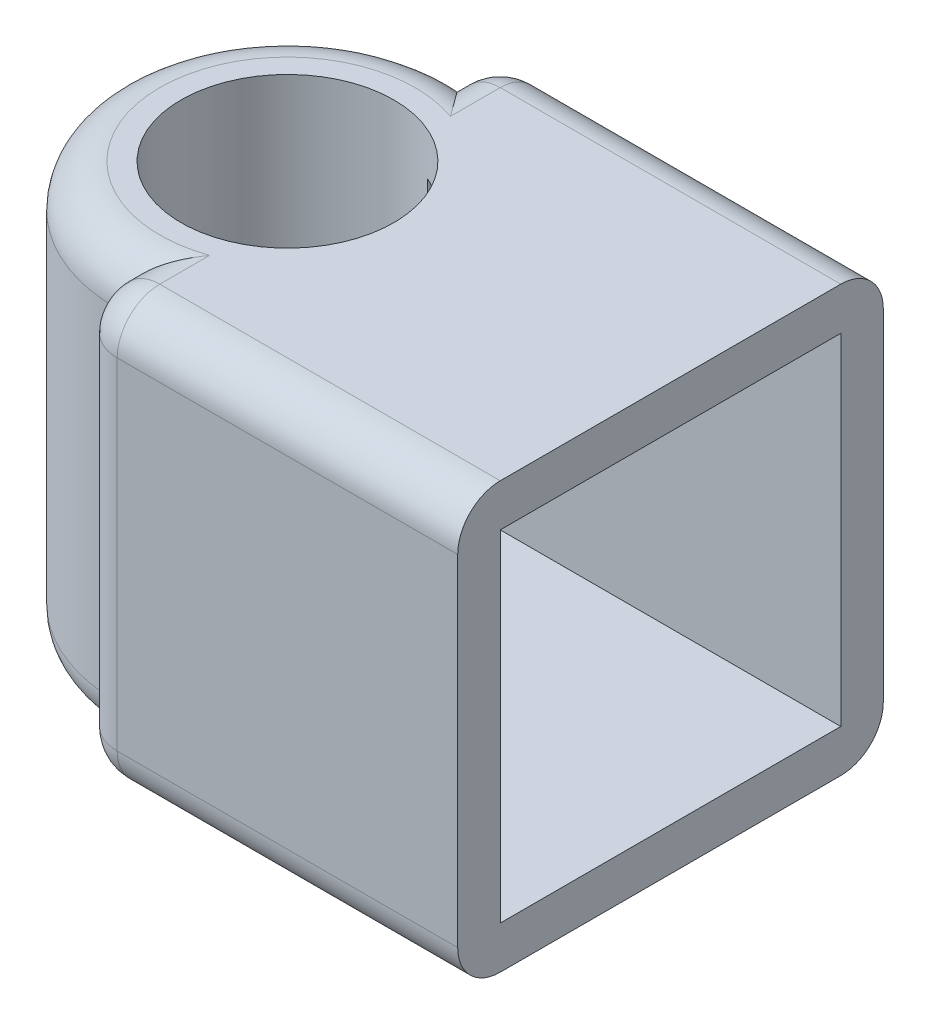
ISO-10303-21;
HEADER;
FILE_DESCRIPTION(('STEP AP214'),'2;1');
FILE_NAME('part.step','',(''),(''),'','','');
FILE_SCHEMA(('AUTOMOTIVE_DESIGN { 1 0 10303 214 1 1 1 1 }'));
ENDSEC;
DATA;
#1=APPLICATION_CONTEXT('core data for automotive mechanical design processes');
#2=APPLICATION_PROTOCOL_DEFINITION('international standard','automotive_design',2000,#1);
#3=PRODUCT_CONTEXT('',#1,'mechanical');
#4=PRODUCT('Part','Part','',(#3));
#5=PRODUCT_RELATED_PRODUCT_CATEGORY('part','',(#4));
#6=PRODUCT_DEFINITION_FORMATION('','',#4);
#7=PRODUCT_DEFINITION_CONTEXT('part definition',#1,'design');
#8=PRODUCT_DEFINITION('design','',#6,#7);
#9=PRODUCT_DEFINITION_SHAPE('','',#8);
#10=(LENGTH_UNIT() NAMED_UNIT(*) SI_UNIT(.MILLI.,.METRE.));
#11=(NAMED_UNIT(*) PLANE_ANGLE_UNIT() SI_UNIT($,.RADIAN.));
#12=(NAMED_UNIT(*) SI_UNIT($,.STERADIAN.) SOLID_ANGLE_UNIT());
#13=UNCERTAINTY_MEASURE_WITH_UNIT(LENGTH_MEASURE(1.E-05),#10,'distance_accuracy_value','');
#14=(GEOMETRIC_REPRESENTATION_CONTEXT(3) GLOBAL_UNCERTAINTY_ASSIGNED_CONTEXT((#13)) GLOBAL_UNIT_ASSIGNED_CONTEXT((#10,
#11,#12)) REPRESENTATION_CONTEXT('',''));
#15=CARTESIAN_POINT('',(0.,0.,0.));
#16=DIRECTION('',(0.,0.,1.));
#17=DIRECTION('',(1.,0.,0.));
#18=AXIS2_PLACEMENT_3D('',#15,#16,#17);
#19=CARTESIAN_POINT('',(10.,0.,1.11022302462516E-13));
#20=DIRECTION('',(-1.,0.,0.));
#21=DIRECTION('',(0.,0.,1.));
#22=AXIS2_PLACEMENT_3D('',#19,#20,#21);
#23=PLANE('',#22);
#24=DIRECTION('',(0.,0.,-1.));
#25=VECTOR('',#24,1.);
#26=CARTESIAN_POINT('',(10.,90.0000000000001,-10.));
#27=LINE('',#26,#25);
#28=CARTESIAN_POINT('',(10.,90.0000000000001,-72.9128784747792));
#29=VERTEX_POINT('',#28);
#30=CARTESIAN_POINT('',(10.,90.0000000000001,-90.));
#31=VERTEX_POINT('',#30);
#32=EDGE_CURVE('E208',#29,#31,#27,.T.);
#33=ORIENTED_EDGE('',*,*,#32,.F.);
#34=DIRECTION('',(0.,-1.,0.));
#35=VECTOR('',#34,1.);
#36=CARTESIAN_POINT('',(10.,100.,-72.9128784747792));
#37=LINE('',#36,#35);
#38=CARTESIAN_POINT('',(10.,10.0000000000001,-72.9128784747793));
#39=VERTEX_POINT('',#38);
#40=EDGE_CURVE('E184',#29,#39,#37,.T.);
#41=ORIENTED_EDGE('',*,*,#40,.T.);
#42=DIRECTION('',(0.,0.,-1.));
#43=VECTOR('',#42,1.);
#44=CARTESIAN_POINT('',(9.99999999999999,10.0000000000001,-10.));
#45=LINE('',#44,#43);
#46=CARTESIAN_POINT('',(10.,10.,-90.));
#47=VERTEX_POINT('',#46);
#48=EDGE_CURVE('E534',#39,#47,#45,.T.);
#49=ORIENTED_EDGE('',*,*,#48,.T.);
#50=DIRECTION('',(0.,-1.,0.));
#51=VECTOR('',#50,1.);
#52=CARTESIAN_POINT('',(10.,90.0000000000001,-90.));
#53=LINE('',#52,#51);
#54=EDGE_CURVE('E207',#31,#47,#53,.T.);
#55=ORIENTED_EDGE('',*,*,#54,.F.);
#56=EDGE_LOOP('',(#33,#41,#49,#55));
#57=FACE_BOUND('',#56,.T.);
#58=ADVANCED_FACE('F52',(#57),#23,.F.);
#59=CARTESIAN_POINT('',(90.,0.,-100.));
#60=DIRECTION('',(0.,1.,0.));
#61=DIRECTION('',(0.,0.,1.));
#62=AXIS2_PLACEMENT_3D('',#59,#60,#61);
#63=PLANE('',#62);
#64=CARTESIAN_POINT('',(0.,1.11022302462516E-13,-50.));
#65=DIRECTION('',(0.,-1.,0.));
#66=DIRECTION('',(0.,0.,-1.));
#67=AXIS2_PLACEMENT_3D('',#64,#65,#66);
#68=CIRCLE('',#67,25.);
#69=CARTESIAN_POINT('',(0.,1.12757025938492E-13,-75.0000000000001));
#70=VERTEX_POINT('',#69);
#71=EDGE_CURVE('E745',#70,#70,#68,.T.);
#72=ORIENTED_EDGE('',*,*,#71,.F.);
#73=EDGE_LOOP('',(#72));
#74=FACE_BOUND('',#73,.T.);
#75=CARTESIAN_POINT('',(0.,1.11022302462516E-13,-50.));
#76=DIRECTION('',(0.,1.,0.));
#77=DIRECTION('',(0.,0.,1.));
#78=AXIS2_PLACEMENT_3D('',#75,#76,#77);
#79=CIRCLE('',#78,30.);
#80=CARTESIAN_POINT('',(10.,0.,-21.7157287525382));
#81=VERTEX_POINT('',#80);
#82=CARTESIAN_POINT('',(10.,0.,-78.2842712474618));
#83=VERTEX_POINT('',#82);
#84=EDGE_CURVE('E189',#81,#83,#79,.F.);
#85=ORIENTED_EDGE('',*,*,#84,.T.);
#86=DIRECTION('',(0.,0.,1.));
#87=VECTOR('',#86,1.);
#88=CARTESIAN_POINT('',(10.,1.11022302462516E-13,-100.));
#89=LINE('',#88,#87);
#90=CARTESIAN_POINT('',(10.,0.,-90.0000000000001));
#91=VERTEX_POINT('',#90);
#92=EDGE_CURVE('E294',#83,#91,#89,.F.);
#93=ORIENTED_EDGE('',*,*,#92,.T.);
#94=DIRECTION('',(-1.,0.,0.));
#95=VECTOR('',#94,1.);
#96=CARTESIAN_POINT('',(90.,0.,-90.));
#97=LINE('',#96,#95);
#98=CARTESIAN_POINT('',(90.,0.,-90.));
#99=VERTEX_POINT('',#98);
#100=EDGE_CURVE('E280',#91,#99,#97,.F.);
#101=ORIENTED_EDGE('',*,*,#100,.T.);
#102=DIRECTION('',(0.,0.,-1.));
#103=VECTOR('',#102,1.);
#104=CARTESIAN_POINT('',(90.,0.,-100.));
#105=LINE('',#104,#103);
#106=CARTESIAN_POINT('',(90.,1.11022302462516E-13,-10.));
#107=VERTEX_POINT('',#106);
#108=EDGE_CURVE('E234',#107,#99,#105,.T.);
#109=ORIENTED_EDGE('',*,*,#108,.F.);
#110=DIRECTION('',(-1.,0.,0.));
#111=VECTOR('',#110,1.);
#112=CARTESIAN_POINT('',(90.,1.11022302462516E-13,-10.));
#113=LINE('',#112,#111);
#114=CARTESIAN_POINT('',(10.,1.11022302462516E-13,-10.));
#115=VERTEX_POINT('',#114);
#116=EDGE_CURVE('E276',#107,#115,#113,.T.);
#117=ORIENTED_EDGE('',*,*,#116,.T.);
#118=DIRECTION('',(0.,0.,1.));
#119=VECTOR('',#118,1.);
#120=CARTESIAN_POINT('',(10.,1.11022302462516E-13,-10.));
#121=LINE('',#120,#119);
#122=EDGE_CURVE('E291',#115,#81,#121,.F.);
#123=ORIENTED_EDGE('',*,*,#122,.T.);
#124=EDGE_LOOP('',(#85,#93,#101,#109,#117,#123));
#125=FACE_BOUND('',#124,.T.);
#126=ADVANCED_FACE('F415',(#74,#125),#63,.F.);
#127=CARTESIAN_POINT('',(90.,100.,-100.));
#128=DIRECTION('',(0.,0.,1.));
#129=DIRECTION('',(1.,0.,0.));
#130=AXIS2_PLACEMENT_3D('',#127,#128,#129);
#131=PLANE('',#130);
#132=DIRECTION('',(-1.,0.,0.));
#133=VECTOR('',#132,1.);
#134=CARTESIAN_POINT('',(90.,10.,-100.));
#135=LINE('',#134,#133);
#136=CARTESIAN_POINT('',(90.,10.,-100.));
#137=VERTEX_POINT('',#136);
#138=CARTESIAN_POINT('',(10.,10.0000000000001,-100.));
#139=VERTEX_POINT('',#138);
#140=EDGE_CURVE('E257',#137,#139,#135,.T.);
#141=ORIENTED_EDGE('',*,*,#140,.T.);
#142=DIRECTION('',(0.,1.,0.));
#143=VECTOR('',#142,1.);
#144=CARTESIAN_POINT('',(10.,90.,-100.));
#145=LINE('',#144,#143);
#146=CARTESIAN_POINT('',(10.,90.,-100.));
#147=VERTEX_POINT('',#146);
#148=EDGE_CURVE('E62',#139,#147,#145,.T.);
#149=ORIENTED_EDGE('',*,*,#148,.T.);
#150=DIRECTION('',(-1.,0.,0.));
#151=VECTOR('',#150,1.);
#152=CARTESIAN_POINT('',(90.,90.,-100.));
#153=LINE('',#152,#151);
#154=CARTESIAN_POINT('',(90.,90.,-100.));
#155=VERTEX_POINT('',#154);
#156=EDGE_CURVE('E261',#147,#155,#153,.F.);
#157=ORIENTED_EDGE('',*,*,#156,.T.);
#158=DIRECTION('',(0.,1.,0.));
#159=VECTOR('',#158,1.);
#160=CARTESIAN_POINT('',(90.,100.,-100.));
#161=LINE('',#160,#159);
#162=EDGE_CURVE('E238',#137,#155,#161,.T.);
#163=ORIENTED_EDGE('',*,*,#162,.F.);
#164=EDGE_LOOP('',(#141,#149,#157,#163));
#165=FACE_BOUND('',#164,.T.);
#166=ADVANCED_FACE('F421',(#165),#131,.F.);
#167=CARTESIAN_POINT('',(90.,100.,0.));
#168=DIRECTION('',(0.,-1.,0.));
#169=DIRECTION('',(0.,0.,-1.));
#170=AXIS2_PLACEMENT_3D('',#167,#168,#169);
#171=PLANE('',#170);
#172=DIRECTION('',(-1.,0.,0.));
#173=VECTOR('',#172,1.);
#174=CARTESIAN_POINT('',(90.,100.,-90.));
#175=LINE('',#174,#173);
#176=CARTESIAN_POINT('',(90.,100.,-90.));
#177=VERTEX_POINT('',#176);
#178=CARTESIAN_POINT('',(9.99999999999999,100.,-90.));
#179=VERTEX_POINT('',#178);
#180=EDGE_CURVE('E253',#177,#179,#175,.T.);
#181=ORIENTED_EDGE('',*,*,#180,.T.);
#182=DIRECTION('',(0.,0.,-1.));
#183=VECTOR('',#182,1.);
#184=CARTESIAN_POINT('',(10.,100.,-90.));
#185=LINE('',#184,#183);
#186=CARTESIAN_POINT('',(10.,100.,-78.284271247462));
#187=VERTEX_POINT('',#186);
#188=EDGE_CURVE('E310',#179,#187,#185,.F.);
#189=ORIENTED_EDGE('',*,*,#188,.T.);
#190=CARTESIAN_POINT('',(0.,100.,-50.));
#191=DIRECTION('',(0.,-1.,0.));
#192=DIRECTION('',(0.,0.,-1.));
#193=AXIS2_PLACEMENT_3D('',#190,#191,#192);
#194=CIRCLE('',#193,30.);
#195=CARTESIAN_POINT('',(10.,100.,-21.7157287525381));
#196=VERTEX_POINT('',#195);
#197=EDGE_CURVE('E304',#187,#196,#194,.F.);
#198=ORIENTED_EDGE('',*,*,#197,.T.);
#199=DIRECTION('',(0.,0.,-1.));
#200=VECTOR('',#199,1.);
#201=CARTESIAN_POINT('',(10.,100.,0.));
#202=LINE('',#201,#200);
#203=CARTESIAN_POINT('',(10.,100.,-10.0000000000001));
#204=VERTEX_POINT('',#203);
#205=EDGE_CURVE('E307',#196,#204,#202,.F.);
#206=ORIENTED_EDGE('',*,*,#205,.T.);
#207=DIRECTION('',(-1.,0.,0.));
#208=VECTOR('',#207,1.);
#209=CARTESIAN_POINT('',(90.,100.,-10.));
#210=LINE('',#209,#208);
#211=CARTESIAN_POINT('',(90.,100.,-10.));
#212=VERTEX_POINT('',#211);
#213=EDGE_CURVE('E250',#204,#212,#210,.F.);
#214=ORIENTED_EDGE('',*,*,#213,.T.);
#215=DIRECTION('',(0.,0.,1.));
#216=VECTOR('',#215,1.);
#217=CARTESIAN_POINT('',(90.,100.,0.));
#218=LINE('',#217,#216);
#219=EDGE_CURVE('E242',#177,#212,#218,.T.);
#220=ORIENTED_EDGE('',*,*,#219,.F.);
#221=EDGE_LOOP('',(#181,#189,#198,#206,#214,#220));
#222=FACE_BOUND('',#221,.T.);
#223=CARTESIAN_POINT('',(0.,100.,-50.));
#224=DIRECTION('',(0.,-1.,0.));
#225=DIRECTION('',(0.,0.,-1.));
#226=AXIS2_PLACEMENT_3D('',#223,#224,#225);
#227=CIRCLE('',#226,25.);
#228=CARTESIAN_POINT('',(0.,100.,-75.0000000000001));
#229=VERTEX_POINT('',#228);
#230=EDGE_CURVE('E200',#229,#229,#227,.T.);
#231=ORIENTED_EDGE('',*,*,#230,.T.);
#232=EDGE_LOOP('',(#231));
#233=FACE_BOUND('',#232,.T.);
#234=ADVANCED_FACE('F440',(#222,#233),#171,.F.);
#235=CARTESIAN_POINT('',(90.,0.,1.11022302462516E-13));
#236=DIRECTION('',(0.,0.,-1.));
#237=DIRECTION('',(0.,1.,0.));
#238=AXIS2_PLACEMENT_3D('',#235,#236,#237);
#239=PLANE('',#238);
#240=DIRECTION('',(-1.,0.,0.));
#241=VECTOR('',#240,1.);
#242=CARTESIAN_POINT('',(90.,90.0000000000001,0.));
#243=LINE('',#242,#241);
#244=CARTESIAN_POINT('',(90.,90.0000000000001,0.));
#245=VERTEX_POINT('',#244);
#246=CARTESIAN_POINT('',(9.99999999999999,90.0000000000001,0.));
#247=VERTEX_POINT('',#246);
#248=EDGE_CURVE('E283',#245,#247,#243,.T.);
#249=ORIENTED_EDGE('',*,*,#248,.T.);
#250=DIRECTION('',(0.,-1.,0.));
#251=VECTOR('',#250,1.);
#252=CARTESIAN_POINT('',(9.99999999999999,10.,0.));
#253=LINE('',#252,#251);
#254=CARTESIAN_POINT('',(9.99999999999999,10.,0.));
#255=VERTEX_POINT('',#254);
#256=EDGE_CURVE('E14',#247,#255,#253,.T.);
#257=ORIENTED_EDGE('',*,*,#256,.T.);
#258=DIRECTION('',(-1.,0.,0.));
#259=VECTOR('',#258,1.);
#260=CARTESIAN_POINT('',(90.,10.,-1.11022302462516E-13));
#261=LINE('',#260,#259);
#262=CARTESIAN_POINT('',(90.,10.,-1.11022302462516E-13));
#263=VERTEX_POINT('',#262);
#264=EDGE_CURVE('E190',#255,#263,#261,.F.);
#265=ORIENTED_EDGE('',*,*,#264,.T.);
#266=DIRECTION('',(0.,-1.,0.));
#267=VECTOR('',#266,1.);
#268=CARTESIAN_POINT('',(90.,0.,1.11022302462516E-13));
#269=LINE('',#268,#267);
#270=EDGE_CURVE('E246',#245,#263,#269,.T.);
#271=ORIENTED_EDGE('',*,*,#270,.F.);
#272=EDGE_LOOP('',(#249,#257,#265,#271));
#273=FACE_BOUND('',#272,.T.);
#274=ADVANCED_FACE('F435',(#273),#239,.F.);
#275=CARTESIAN_POINT('',(90.,0.,1.11022302462516E-13));
#276=DIRECTION('',(-1.,0.,0.));
#277=DIRECTION('',(0.,0.,1.));
#278=AXIS2_PLACEMENT_3D('',#275,#276,#277);
#279=PLANE('',#278);
#280=DIRECTION('',(0.,-1.,0.));
#281=VECTOR('',#280,1.);
#282=CARTESIAN_POINT('',(90.,90.0000000000001,-90.));
#283=LINE('',#282,#281);
#284=CARTESIAN_POINT('',(90.,90.0000000000001,-90.));
#285=VERTEX_POINT('',#284);
#286=CARTESIAN_POINT('',(90.,10.,-90.0000000000001));
#287=VERTEX_POINT('',#286);
#288=EDGE_CURVE('E224',#285,#287,#283,.T.);
#289=ORIENTED_EDGE('',*,*,#288,.T.);
#290=DIRECTION('',(0.,0.,-1.));
#291=VECTOR('',#290,1.);
#292=CARTESIAN_POINT('',(90.,10.,-10.));
#293=LINE('',#292,#291);
#294=CARTESIAN_POINT('',(90.,10.,-10.));
#295=VERTEX_POINT('',#294);
#296=EDGE_CURVE('E530',#295,#287,#293,.T.);
#297=ORIENTED_EDGE('',*,*,#296,.F.);
#298=DIRECTION('',(0.,-1.,0.));
#299=VECTOR('',#298,1.);
#300=CARTESIAN_POINT('',(90.,90.,-10.));
#301=LINE('',#300,#299);
#302=CARTESIAN_POINT('',(90.,90.,-10.));
#303=VERTEX_POINT('',#302);
#304=EDGE_CURVE('E214',#303,#295,#301,.T.);
#305=ORIENTED_EDGE('',*,*,#304,.F.);
#306=DIRECTION('',(0.,0.,-1.));
#307=VECTOR('',#306,1.);
#308=CARTESIAN_POINT('',(90.,90.,-10.));
#309=LINE('',#308,#307);
#310=EDGE_CURVE('E223',#303,#285,#309,.T.);
#311=ORIENTED_EDGE('',*,*,#310,.T.);
#312=EDGE_LOOP('',(#289,#297,#305,#311));
#313=FACE_BOUND('',#312,.T.);
#314=ORIENTED_EDGE('',*,*,#162,.T.);
#315=CARTESIAN_POINT('',(90.,90.0000000000001,-90.));
#316=DIRECTION('',(-1.,0.,0.));
#317=DIRECTION('',(0.,0.,1.));
#318=AXIS2_PLACEMENT_3D('',#315,#316,#317);
#319=CIRCLE('',#318,10.);
#320=EDGE_CURVE('E273',#155,#177,#319,.F.);
#321=ORIENTED_EDGE('',*,*,#320,.T.);
#322=ORIENTED_EDGE('',*,*,#219,.T.);
#323=CARTESIAN_POINT('',(90.,90.,-10.));
#324=DIRECTION('',(-1.,0.,0.));
#325=DIRECTION('',(0.,0.,1.));
#326=AXIS2_PLACEMENT_3D('',#323,#324,#325);
#327=CIRCLE('',#326,10.);
#328=EDGE_CURVE('E264',#212,#245,#327,.F.);
#329=ORIENTED_EDGE('',*,*,#328,.T.);
#330=ORIENTED_EDGE('',*,*,#270,.T.);
#331=CARTESIAN_POINT('',(90.,10.,-10.));
#332=DIRECTION('',(-1.,0.,0.));
#333=DIRECTION('',(0.,0.,1.));
#334=AXIS2_PLACEMENT_3D('',#331,#332,#333);
#335=CIRCLE('',#334,10.);
#336=EDGE_CURVE('E267',#263,#107,#335,.F.);
#337=ORIENTED_EDGE('',*,*,#336,.T.);
#338=ORIENTED_EDGE('',*,*,#108,.T.);
#339=CARTESIAN_POINT('',(90.,10.,-90.0000000000001));
#340=DIRECTION('',(-1.,0.,0.));
#341=DIRECTION('',(0.,0.,1.));
#342=AXIS2_PLACEMENT_3D('',#339,#340,#341);
#343=CIRCLE('',#342,10.);
#344=EDGE_CURVE('E270',#99,#137,#343,.F.);
#345=ORIENTED_EDGE('',*,*,#344,.T.);
#346=EDGE_LOOP('',(#314,#321,#322,#329,#330,#337,#338,#345));
#347=FACE_BOUND('',#346,.T.);
#348=ADVANCED_FACE('F428',(#313,#347),#279,.F.);
#349=CARTESIAN_POINT('',(9.99999999999999,10.0000000000001,-10.));
#350=VERTEX_POINT('',#349);
#351=CARTESIAN_POINT('',(10.,10.,-27.0871215252207));
#352=VERTEX_POINT('',#351);
#353=EDGE_CURVE('E198',#350,#352,#45,.T.);
#354=ORIENTED_EDGE('',*,*,#353,.T.);
#355=DIRECTION('',(0.,-1.,0.));
#356=VECTOR('',#355,1.);
#357=CARTESIAN_POINT('',(10.,100.,-27.0871215252209));
#358=LINE('',#357,#356);
#359=CARTESIAN_POINT('',(10.,90.0000000000001,-27.0871215252207));
#360=VERTEX_POINT('',#359);
#361=EDGE_CURVE('E181',#352,#360,#358,.F.);
#362=ORIENTED_EDGE('',*,*,#361,.T.);
#363=CARTESIAN_POINT('',(10.,90.0000000000001,-10.));
#364=VERTEX_POINT('',#363);
#365=EDGE_CURVE('E197',#364,#360,#27,.T.);
#366=ORIENTED_EDGE('',*,*,#365,.F.);
#367=DIRECTION('',(0.,-1.,0.));
#368=VECTOR('',#367,1.);
#369=CARTESIAN_POINT('',(10.,90.0000000000001,-10.));
#370=LINE('',#369,#368);
#371=EDGE_CURVE('E218',#364,#350,#370,.T.);
#372=ORIENTED_EDGE('',*,*,#371,.T.);
#373=EDGE_LOOP('',(#354,#362,#366,#372));
#374=FACE_BOUND('',#373,.T.);
#375=ADVANCED_FACE('F195',(#374),#23,.F.);
#376=CARTESIAN_POINT('',(-113.137084989848,10.0000000000001,-10.));
#377=DIRECTION('',(0.,-1.,0.));
#378=DIRECTION('',(0.,0.,-1.));
#379=AXIS2_PLACEMENT_3D('',#376,#377,#378);
#380=PLANE('',#379);
#381=ORIENTED_EDGE('',*,*,#48,.F.);
#382=CARTESIAN_POINT('',(0.,10.,-50.));
#383=DIRECTION('',(0.,-1.,0.));
#384=DIRECTION('',(0.,0.,-1.));
#385=AXIS2_PLACEMENT_3D('',#382,#383,#384);
#386=CIRCLE('',#385,25.);
#387=EDGE_CURVE('E521',#39,#352,#386,.T.);
#388=ORIENTED_EDGE('',*,*,#387,.T.);
#389=ORIENTED_EDGE('',*,*,#353,.F.);
#390=DIRECTION('',(1.,0.,0.));
#391=VECTOR('',#390,1.);
#392=CARTESIAN_POINT('',(-113.137084989848,10.0000000000001,-10.));
#393=LINE('',#392,#391);
#394=EDGE_CURVE('E231',#350,#295,#393,.T.);
#395=ORIENTED_EDGE('',*,*,#394,.T.);
#396=ORIENTED_EDGE('',*,*,#296,.T.);
#397=DIRECTION('',(1.,0.,0.));
#398=VECTOR('',#397,1.);
#399=CARTESIAN_POINT('',(-113.137084989848,10.,-90.));
#400=LINE('',#399,#398);
#401=EDGE_CURVE('E228',#47,#287,#400,.T.);
#402=ORIENTED_EDGE('',*,*,#401,.F.);
#403=EDGE_LOOP('',(#381,#388,#389,#395,#396,#402));
#404=FACE_BOUND('',#403,.T.);
#405=ADVANCED_FACE('F427',(#404),#380,.F.);
#406=CARTESIAN_POINT('',(-113.137084989848,90.0000000000001,-90.0000000000001));
#407=DIRECTION('',(0.,0.,1.));
#408=DIRECTION('',(1.,0.,0.));
#409=AXIS2_PLACEMENT_3D('',#406,#407,#408);
#410=PLANE('',#409);
#411=ORIENTED_EDGE('',*,*,#54,.T.);
#412=ORIENTED_EDGE('',*,*,#401,.T.);
#413=ORIENTED_EDGE('',*,*,#288,.F.);
#414=DIRECTION('',(1.,0.,0.));
#415=VECTOR('',#414,1.);
#416=CARTESIAN_POINT('',(-113.137084989848,90.0000000000001,-90.0000000000001));
#417=LINE('',#416,#415);
#418=EDGE_CURVE('E225',#31,#285,#417,.T.);
#419=ORIENTED_EDGE('',*,*,#418,.F.);
#420=EDGE_LOOP('',(#411,#412,#413,#419));
#421=FACE_BOUND('',#420,.T.);
#422=ADVANCED_FACE('F433',(#421),#410,.T.);
#423=CARTESIAN_POINT('',(-113.137084989848,90.0000000000001,-10.0000000000001));
#424=DIRECTION('',(0.,-1.,0.));
#425=DIRECTION('',(0.,0.,-1.));
#426=AXIS2_PLACEMENT_3D('',#423,#424,#425);
#427=PLANE('',#426);
#428=CARTESIAN_POINT('',(0.,90.0000000000001,-50.));
#429=DIRECTION('',(0.,-1.,0.));
#430=DIRECTION('',(0.,0.,-1.));
#431=AXIS2_PLACEMENT_3D('',#428,#429,#430);
#432=CIRCLE('',#431,25.);
#433=EDGE_CURVE('E178',#29,#360,#432,.T.);
#434=ORIENTED_EDGE('',*,*,#433,.F.);
#435=ORIENTED_EDGE('',*,*,#32,.T.);
#436=ORIENTED_EDGE('',*,*,#418,.T.);
#437=ORIENTED_EDGE('',*,*,#310,.F.);
#438=DIRECTION('',(1.,0.,0.));
#439=VECTOR('',#438,1.);
#440=CARTESIAN_POINT('',(-113.137084989848,90.0000000000001,-10.0000000000001));
#441=LINE('',#440,#439);
#442=EDGE_CURVE('E205',#364,#303,#441,.T.);
#443=ORIENTED_EDGE('',*,*,#442,.F.);
#444=ORIENTED_EDGE('',*,*,#365,.T.);
#445=EDGE_LOOP('',(#434,#435,#436,#437,#443,#444));
#446=FACE_BOUND('',#445,.T.);
#447=ADVANCED_FACE('F203',(#446),#427,.T.);
#448=CARTESIAN_POINT('',(-113.137084989848,90.0000000000001,-10.0000000000001));
#449=DIRECTION('',(0.,0.,1.));
#450=DIRECTION('',(0.,-1.,0.));
#451=AXIS2_PLACEMENT_3D('',#448,#449,#450);
#452=PLANE('',#451);
#453=ORIENTED_EDGE('',*,*,#442,.T.);
#454=ORIENTED_EDGE('',*,*,#304,.T.);
#455=ORIENTED_EDGE('',*,*,#394,.F.);
#456=ORIENTED_EDGE('',*,*,#371,.F.);
#457=EDGE_LOOP('',(#453,#454,#455,#456));
#458=FACE_BOUND('',#457,.T.);
#459=ADVANCED_FACE('F456',(#458),#452,.F.);
#460=CARTESIAN_POINT('',(90.,90.0000000000001,-90.));
#461=DIRECTION('',(-1.,0.,0.));
#462=DIRECTION('',(0.,0.,1.));
#463=AXIS2_PLACEMENT_3D('',#460,#461,#462);
#464=CYLINDRICAL_SURFACE('',#463,10.);
#465=ORIENTED_EDGE('',*,*,#156,.F.);
#466=CARTESIAN_POINT('',(10.,90.0000000000001,-90.));
#467=DIRECTION('',(-1.,0.,0.));
#468=DIRECTION('',(0.,0.,1.));
#469=AXIS2_PLACEMENT_3D('',#466,#467,#468);
#470=CIRCLE('',#469,10.);
#471=EDGE_CURVE('E301',#147,#179,#470,.F.);
#472=ORIENTED_EDGE('',*,*,#471,.T.);
#473=ORIENTED_EDGE('',*,*,#180,.F.);
#474=ORIENTED_EDGE('',*,*,#320,.F.);
#475=EDGE_LOOP('',(#465,#472,#473,#474));
#476=FACE_BOUND('',#475,.T.);
#477=ADVANCED_FACE('F452',(#476),#464,.T.);
#478=CARTESIAN_POINT('',(90.,10.,-90.0000000000001));
#479=DIRECTION('',(-1.,0.,0.));
#480=DIRECTION('',(0.,0.,1.));
#481=AXIS2_PLACEMENT_3D('',#478,#479,#480);
#482=CYLINDRICAL_SURFACE('',#481,10.);
#483=ORIENTED_EDGE('',*,*,#100,.F.);
#484=CARTESIAN_POINT('',(10.,10.,-90.));
#485=DIRECTION('',(-1.,0.,0.));
#486=DIRECTION('',(0.,0.,1.));
#487=AXIS2_PLACEMENT_3D('',#484,#485,#486);
#488=CIRCLE('',#487,10.);
#489=EDGE_CURVE('E297',#91,#139,#488,.F.);
#490=ORIENTED_EDGE('',*,*,#489,.T.);
#491=ORIENTED_EDGE('',*,*,#140,.F.);
#492=ORIENTED_EDGE('',*,*,#344,.F.);
#493=EDGE_LOOP('',(#483,#490,#491,#492));
#494=FACE_BOUND('',#493,.T.);
#495=ADVANCED_FACE('F455',(#494),#482,.T.);
#496=CARTESIAN_POINT('',(90.,10.,-10.));
#497=DIRECTION('',(-1.,0.,0.));
#498=DIRECTION('',(0.,0.,1.));
#499=AXIS2_PLACEMENT_3D('',#496,#497,#498);
#500=CYLINDRICAL_SURFACE('',#499,10.);
#501=ORIENTED_EDGE('',*,*,#264,.F.);
#502=CARTESIAN_POINT('',(9.99999999999999,10.0000000000001,-10.));
#503=DIRECTION('',(-1.,0.,0.));
#504=DIRECTION('',(0.,0.,1.));
#505=AXIS2_PLACEMENT_3D('',#502,#503,#504);
#506=CIRCLE('',#505,10.);
#507=EDGE_CURVE('E316',#255,#115,#506,.F.);
#508=ORIENTED_EDGE('',*,*,#507,.T.);
#509=ORIENTED_EDGE('',*,*,#116,.F.);
#510=ORIENTED_EDGE('',*,*,#336,.F.);
#511=EDGE_LOOP('',(#501,#508,#509,#510));
#512=FACE_BOUND('',#511,.T.);
#513=ADVANCED_FACE('F460',(#512),#500,.T.);
#514=CARTESIAN_POINT('',(90.,90.,-10.));
#515=DIRECTION('',(-1.,0.,0.));
#516=DIRECTION('',(0.,0.,1.));
#517=AXIS2_PLACEMENT_3D('',#514,#515,#516);
#518=CYLINDRICAL_SURFACE('',#517,10.);
#519=ORIENTED_EDGE('',*,*,#213,.F.);
#520=CARTESIAN_POINT('',(10.,90.0000000000001,-10.));
#521=DIRECTION('',(-1.,0.,0.));
#522=DIRECTION('',(0.,0.,1.));
#523=AXIS2_PLACEMENT_3D('',#520,#521,#522);
#524=CIRCLE('',#523,10.);
#525=EDGE_CURVE('E313',#204,#247,#524,.F.);
#526=ORIENTED_EDGE('',*,*,#525,.T.);
#527=ORIENTED_EDGE('',*,*,#248,.F.);
#528=ORIENTED_EDGE('',*,*,#328,.F.);
#529=EDGE_LOOP('',(#519,#526,#527,#528));
#530=FACE_BOUND('',#529,.T.);
#531=ADVANCED_FACE('F464',(#530),#518,.T.);
#532=CARTESIAN_POINT('',(0.,100.,-50.));
#533=DIRECTION('',(0.,-1.,0.));
#534=DIRECTION('',(0.,0.,-1.));
#535=AXIS2_PLACEMENT_3D('',#532,#533,#534);
#536=CYLINDRICAL_SURFACE('',#535,40.);
#537=DIRECTION('',(0.,-1.,0.));
#538=VECTOR('',#537,1.);
#539=CARTESIAN_POINT('',(2.91433543964104E-13,100.,-10.));
#540=LINE('',#539,#538);
#541=CARTESIAN_POINT('',(2.91433543964104E-13,90.0000000000001,-10.));
#542=VERTEX_POINT('',#541);
#543=CARTESIAN_POINT('',(2.63677968348475E-13,10.0000000000001,-10.0000000000001));
#544=VERTEX_POINT('',#543);
#545=EDGE_CURVE('E216',#542,#544,#540,.T.);
#546=ORIENTED_EDGE('',*,*,#545,.F.);
#547=CARTESIAN_POINT('',(0.,90.0000000000001,-50.));
#548=DIRECTION('',(0.,-1.,0.));
#549=DIRECTION('',(0.,0.,-1.));
#550=AXIS2_PLACEMENT_3D('',#547,#548,#549);
#551=CIRCLE('',#550,40.);
#552=CARTESIAN_POINT('',(0.,90.0000000000001,-90.0000000000001));
#553=VERTEX_POINT('',#552);
#554=EDGE_CURVE('E322',#542,#553,#551,.T.);
#555=ORIENTED_EDGE('',*,*,#554,.T.);
#556=DIRECTION('',(0.,-1.,0.));
#557=VECTOR('',#556,1.);
#558=CARTESIAN_POINT('',(0.,100.,-90.0000000000001));
#559=LINE('',#558,#557);
#560=CARTESIAN_POINT('',(0.,10.,-90.));
#561=VERTEX_POINT('',#560);
#562=EDGE_CURVE('E70',#553,#561,#559,.T.);
#563=ORIENTED_EDGE('',*,*,#562,.T.);
#564=CARTESIAN_POINT('',(0.,10.,-50.));
#565=DIRECTION('',(0.,1.,0.));
#566=DIRECTION('',(0.,0.,1.));
#567=AXIS2_PLACEMENT_3D('',#564,#565,#566);
#568=CIRCLE('',#567,40.);
#569=EDGE_CURVE('E319',#561,#544,#568,.T.);
#570=ORIENTED_EDGE('',*,*,#569,.T.);
#571=EDGE_LOOP('',(#546,#555,#563,#570));
#572=FACE_BOUND('',#571,.T.);
#573=ADVANCED_FACE('F467',(#572),#536,.T.);
#574=CARTESIAN_POINT('',(0.,100.,-50.));
#575=DIRECTION('',(0.,-1.,0.));
#576=DIRECTION('',(0.,0.,-1.));
#577=AXIS2_PLACEMENT_3D('',#574,#575,#576);
#578=CYLINDRICAL_SURFACE('',#577,25.);
#579=ORIENTED_EDGE('',*,*,#230,.F.);
#580=EDGE_LOOP('',(#579));
#581=FACE_BOUND('',#580,.T.);
#582=ORIENTED_EDGE('',*,*,#71,.T.);
#583=EDGE_LOOP('',(#582));
#584=FACE_BOUND('',#583,.T.);
#585=ORIENTED_EDGE('',*,*,#40,.F.);
#586=ORIENTED_EDGE('',*,*,#433,.T.);
#587=ORIENTED_EDGE('',*,*,#361,.F.);
#588=ORIENTED_EDGE('',*,*,#387,.F.);
#589=EDGE_LOOP('',(#585,#586,#587,#588));
#590=FACE_BOUND('',#589,.T.);
#591=ADVANCED_FACE('F180',(#581,#584,#590),#578,.F.);
#592=CARTESIAN_POINT('',(10.,90.0000000000001,-10.));
#593=DIRECTION('',(-1.,0.,0.));
#594=DIRECTION('',(0.,0.,1.));
#595=AXIS2_PLACEMENT_3D('',#592,#593,#594);
#596=SPHERICAL_SURFACE('',#595,10.);
#597=CARTESIAN_POINT('',(10.,90.0000000000001,-10.));
#598=DIRECTION('',(0.,-1.,0.));
#599=DIRECTION('',(0.,0.,-1.));
#600=AXIS2_PLACEMENT_3D('',#597,#598,#599);
#601=CIRCLE('',#600,10.);
#602=EDGE_CURVE('E403',#247,#542,#601,.T.);
#603=ORIENTED_EDGE('',*,*,#602,.F.);
#604=ORIENTED_EDGE('',*,*,#525,.F.);
#605=CARTESIAN_POINT('',(10.,90.0000000000001,-10.));
#606=DIRECTION('',(0.,0.,-1.));
#607=DIRECTION('',(0.,1.,0.));
#608=AXIS2_PLACEMENT_3D('',#605,#606,#607);
#609=CIRCLE('',#608,10.);
#610=EDGE_CURVE('E56',#542,#204,#609,.T.);
#611=ORIENTED_EDGE('',*,*,#610,.F.);
#612=EDGE_LOOP('',(#603,#604,#611));
#613=FACE_BOUND('',#612,.T.);
#614=ADVANCED_FACE('F54',(#613),#596,.T.);
#615=CARTESIAN_POINT('',(9.99999999999999,90.0000000000001,0.));
#616=DIRECTION('',(0.,0.,1.));
#617=DIRECTION('',(0.,-1.,0.));
#618=AXIS2_PLACEMENT_3D('',#615,#616,#617);
#619=CYLINDRICAL_SURFACE('',#618,10.);
#620=ORIENTED_EDGE('',*,*,#610,.T.);
#621=ORIENTED_EDGE('',*,*,#205,.F.);
#622=CARTESIAN_POINT('',(1.52655665885959E-13,90.0000000000001,-10.));
#623=CARTESIAN_POINT('',(-1.54938099097032E-06,90.110867295278,-9.99999885790481));
#624=CARTESIAN_POINT('',(0.00184427869516265,90.2217177439418,-10.0018442288774));
#625=CARTESIAN_POINT('',(0.00921060976328039,90.4431682072289,-10.0092114234934));
#626=CARTESIAN_POINT('',(0.0147309135999148,90.553768235099,-10.0147330478852));
#627=CARTESIAN_POINT('',(0.0367601205868915,90.8846813101919,-10.0367741345617));
#628=CARTESIAN_POINT('',(0.0587373965797679,91.1043133734806,-10.0587698754941));
#629=CARTESIAN_POINT('',(0.116582745258378,91.538047491153,-10.116742794526));
#630=CARTESIAN_POINT('',(0.152341308658577,91.7521792911405,-10.1526097563453));
#631=CARTESIAN_POINT('',(0.237042602681973,92.1751272444765,-10.2377264191177));
#632=CARTESIAN_POINT('',(0.285986885938575,92.3839427686564,-10.2869776960949));
#633=CARTESIAN_POINT('',(0.395992607939084,92.7942889761559,-10.3979336950488));
#634=CARTESIAN_POINT('',(0.457020580692666,92.9958380014168,-10.4596040300933));
#635=CARTESIAN_POINT('',(0.590273438031672,93.3912533555474,-10.5946363813946));
#636=CARTESIAN_POINT('',(0.662503323403302,93.5851162043627,-10.6680036198242));
#637=CARTESIAN_POINT('',(0.817161969117088,93.9645329549568,-10.8256045818276));
#638=CARTESIAN_POINT('',(0.89960604019357,94.1500738012364,-10.9098546266332));
#639=CARTESIAN_POINT('',(1.07350561263383,94.5119869539876,-11.088208631061));
#640=CARTESIAN_POINT('',(1.16496313906701,94.6883571864218,-11.1823148053768));
#641=CARTESIAN_POINT('',(1.39145316667823,95.0956477735648,-11.4162980342401));
#642=CARTESIAN_POINT('',(1.53000465777007,95.3223456301973,-11.5601447371127));
#643=CARTESIAN_POINT('',(1.81944200904365,95.7573237570667,-11.862518319681));
#644=CARTESIAN_POINT('',(1.97033175183572,95.9655981865507,-12.021049822501));
#645=CARTESIAN_POINT('',(2.28227436457353,96.3640241098656,-12.3510252992394));
#646=CARTESIAN_POINT('',(2.4433401103932,96.5541518469488,-12.5224856875868));
#647=CARTESIAN_POINT('',(2.77337849815219,96.9163563580975,-12.8764082707827));
#648=CARTESIAN_POINT('',(2.94235136760154,97.0884326123089,-13.0588707822367));
#649=CARTESIAN_POINT('',(3.35892375846768,97.4839704326806,-13.5122375139894));
#650=CARTESIAN_POINT('',(3.60966603868993,97.6985513516163,-13.7880254682758));
#651=CARTESIAN_POINT('',(4.11931327842922,98.0945500362803,-14.3554277920465));
#652=CARTESIAN_POINT('',(4.37822168736581,98.2759535616346,-14.6470488880999));
#653=CARTESIAN_POINT('',(4.90112924236372,98.6079939526653,-15.2437231073188));
#654=CARTESIAN_POINT('',(5.16513505894233,98.7585870242367,-15.5487946110212));
#655=CARTESIAN_POINT('',(5.69512791759086,99.03088197129,-16.1697443343543));
#656=CARTESIAN_POINT('',(5.9611147766574,99.1525864820997,-16.4856215652341));
#657=CARTESIAN_POINT('',(6.5482923106735,99.391808780093,-17.1931956329261));
#658=CARTESIAN_POINT('',(6.86945231594819,99.5031849597768,-17.5869914133612));
#659=CARTESIAN_POINT('',(7.50856028458213,99.6903883835328,-18.3855302354855));
#660=CARTESIAN_POINT('',(7.82650736301266,99.7662060816061,-18.7902761860385));
#661=CARTESIAN_POINT('',(8.45627276051971,99.8853148931085,-19.6081395767716));
#662=CARTESIAN_POINT('',(8.76809955930362,99.9286546379913,-20.021243545428));
#663=CARTESIAN_POINT('',(9.3841709689169,99.9858098496745,-20.8548466081305));
#664=CARTESIAN_POINT('',(9.68841842351271,99.9996365598086,-21.2753428244384));
#665=CARTESIAN_POINT('',(9.99207118067775,99.9999976417423,-21.7045173736077));
#666=CARTESIAN_POINT('',(9.99603599055356,99.9999999987151,-21.7101227948058));
#667=CARTESIAN_POINT('',(10.,100.,-21.7157287525381));
#668=B_SPLINE_CURVE_WITH_KNOTS('',3,(#622,#623,#624,#625,#626,#627,#628,#629,#630,#631,#632,
#633,#634,#635,#636,#637,#638,#639,#640,#641,#642,#643,#644,#645,#646,#647,#648,#649,#650,#651,
#652,#653,#654,#655,#656,#657,#658,#659,#660,#661,#662,#663,#664,#665,#666,#667),.UNSPECIFIED.,
.F.,.F.,(4,2,2,2,2,2,2,2,2,2,2,2,2,2,2,2,2,2,2,2,2,2,4),(0.,0.3325378755955,0.665057729219274,
1.32948181943131,1.98873161876809,2.64805907946847,3.30558543802137,3.96340618062227,
4.62222518419454,5.28119254473741,6.18622380509013,7.09154096552644,7.99802751676916,
8.90454016621663,10.1928390175828,11.4816895404279,12.7723595044204,14.0629116831459,
15.6220245281733,17.1815556920252,18.7387469716763,20.2953449152462,20.3159425881022),.UNSPECIFIED.);
#669=EDGE_CURVE('E395',#542,#196,#668,.T.);
#670=ORIENTED_EDGE('',*,*,#669,.F.);
#671=EDGE_LOOP('',(#620,#621,#670));
#672=FACE_BOUND('',#671,.T.);
#673=ADVANCED_FACE('F405',(#672),#619,.T.);
#674=CARTESIAN_POINT('',(10.,1.11022302462516E-13,-10.));
#675=DIRECTION('',(0.,1.,0.));
#676=DIRECTION('',(0.,0.,1.));
#677=AXIS2_PLACEMENT_3D('',#674,#675,#676);
#678=CYLINDRICAL_SURFACE('',#677,10.);
#679=ORIENTED_EDGE('',*,*,#602,.T.);
#680=ORIENTED_EDGE('',*,*,#545,.T.);
#681=CARTESIAN_POINT('',(9.99999999999999,10.0000000000001,-10.));
#682=DIRECTION('',(0.,-1.,0.));
#683=DIRECTION('',(0.,0.,-1.));
#684=AXIS2_PLACEMENT_3D('',#681,#682,#683);
#685=CIRCLE('',#684,10.);
#686=EDGE_CURVE('E404',#255,#544,#685,.T.);
#687=ORIENTED_EDGE('',*,*,#686,.F.);
#688=ORIENTED_EDGE('',*,*,#256,.F.);
#689=EDGE_LOOP('',(#679,#680,#687,#688));
#690=FACE_BOUND('',#689,.T.);
#691=ADVANCED_FACE('F382',(#690),#678,.T.);
#692=CARTESIAN_POINT('',(0.,90.0000000000001,-50.));
#693=DIRECTION('',(0.,-1.,0.));
#694=DIRECTION('',(0.,0.,-1.));
#695=AXIS2_PLACEMENT_3D('',#692,#693,#694);
#696=TOROIDAL_SURFACE('',#695,30.,10.);
#697=ORIENTED_EDGE('',*,*,#669,.T.);
#698=ORIENTED_EDGE('',*,*,#197,.F.);
#699=CARTESIAN_POINT('',(0.,90.0000000000001,-90.0000000000001));
#700=CARTESIAN_POINT('',(-1.54938103964229E-06,90.110867295278,-90.0000011420953));
#701=CARTESIAN_POINT('',(0.00184427869515131,90.2217177439418,-89.9981557711227));
#702=CARTESIAN_POINT('',(0.00921060976329558,90.4431682072289,-89.9907885765067));
#703=CARTESIAN_POINT('',(0.0147309135999193,90.553768235099,-89.9852669521149));
#704=CARTESIAN_POINT('',(0.0367601205868777,90.8846813101919,-89.9632258654384));
#705=CARTESIAN_POINT('',(0.0587373965797604,91.1043133734806,-89.941230124506));
#706=CARTESIAN_POINT('',(0.116582745258365,91.5380474911529,-89.8832572054741));
#707=CARTESIAN_POINT('',(0.152341308658552,91.7521792911403,-89.8473902436548));
#708=CARTESIAN_POINT('',(0.237042602681949,92.1751272444764,-89.7622735808825));
#709=CARTESIAN_POINT('',(0.285986885938564,92.3839427686563,-89.7130223039053));
#710=CARTESIAN_POINT('',(0.395992607939071,92.7942889761558,-89.6020663049514));
#711=CARTESIAN_POINT('',(0.457020580692639,92.9958380014167,-89.5403959699068));
#712=CARTESIAN_POINT('',(0.590273438031643,93.3912533555473,-89.4053636186055));
#713=CARTESIAN_POINT('',(0.662503323403286,93.5851162043627,-89.3319963801759));
#714=CARTESIAN_POINT('',(0.817161969117086,93.9645329549568,-89.1743954181726));
#715=CARTESIAN_POINT('',(0.89960604019357,94.1500738012364,-89.0901453733669));
#716=CARTESIAN_POINT('',(1.07350561263382,94.5119869539876,-88.9117913689391));
#717=CARTESIAN_POINT('',(1.164963139067,94.6883571864218,-88.8176851946232));
#718=CARTESIAN_POINT('',(1.39145316667821,95.0956477735648,-88.5837019657599));
#719=CARTESIAN_POINT('',(1.53000465777006,95.3223456301973,-88.4398552628874));
#720=CARTESIAN_POINT('',(1.81944200904361,95.7573237570667,-88.1374816803192));
#721=CARTESIAN_POINT('',(1.97033175183566,95.9655981865506,-87.9789501774992));
#722=CARTESIAN_POINT('',(2.28227436457346,96.3640241098655,-87.6489747007608));
#723=CARTESIAN_POINT('',(2.44334011039314,96.5541518469488,-87.4775143124134));
#724=CARTESIAN_POINT('',(2.77337849815216,96.9163563580975,-87.1235917292174));
#725=CARTESIAN_POINT('',(2.94235136760151,97.088432612309,-86.9411292177634));
#726=CARTESIAN_POINT('',(3.35892375846776,97.4839704326807,-86.4877624860106));
#727=CARTESIAN_POINT('',(3.60966603869012,97.6985513516165,-86.2119745317241));
#728=CARTESIAN_POINT('',(4.11931327842961,98.0945500362806,-85.6445722079532));
#729=CARTESIAN_POINT('',(4.37822168736627,98.275953561635,-85.3529511118997));
#730=CARTESIAN_POINT('',(4.90112924236414,98.6079939526656,-84.7562768926808));
#731=CARTESIAN_POINT('',(5.16513505894263,98.7585870242369,-84.4512053889786));
#732=CARTESIAN_POINT('',(5.69512791759096,99.0308819712901,-83.8302556656457));
#733=CARTESIAN_POINT('',(5.96111477665742,99.1525864820997,-83.514378434766));
#734=CARTESIAN_POINT('',(6.54829231067344,99.3918087800929,-82.8068043670742));
#735=CARTESIAN_POINT('',(6.86945231594814,99.5031849597768,-82.4130085866394));
#736=CARTESIAN_POINT('',(7.50856028458141,99.6903883835326,-81.6144697645152));
#737=CARTESIAN_POINT('',(7.82650736301128,99.7662060816056,-81.2097238139621));
#738=CARTESIAN_POINT('',(8.45627276051947,99.8853148931086,-80.3918604232301));
#739=CARTESIAN_POINT('',(8.76809955930517,99.9286546379923,-79.9787564545748));
#740=CARTESIAN_POINT('',(9.38417096891422,99.9858098496734,-79.1451533918687));
#741=CARTESIAN_POINT('',(9.688418423504,99.9996365598045,-78.7246571755559));
#742=CARTESIAN_POINT('',(9.99207118067757,99.9999976417423,-78.2954826263921));
#743=CARTESIAN_POINT('',(9.99603599055347,99.9999999987151,-78.2898772051942));
#744=CARTESIAN_POINT('',(10.,100.,-78.284271247462));
#745=B_SPLINE_CURVE_WITH_KNOTS('',3,(#699,#700,#701,#702,#703,#704,#705,#706,#707,#708,#709,
#710,#711,#712,#713,#714,#715,#716,#717,#718,#719,#720,#721,#722,#723,#724,#725,#726,#727,#728,
#729,#730,#731,#732,#733,#734,#735,#736,#737,#738,#739,#740,#741,#742,#743,#744),.UNSPECIFIED.,
.F.,.F.,(4,2,2,2,2,2,2,2,2,2,2,2,2,2,2,2,2,2,2,2,2,2,4),(0.,0.33253787559546,0.665057729219206,
1.32948181943119,1.9887316187679,2.64805907946828,3.30558543802124,3.9634061806222,
4.62222518419449,5.28119254473741,6.18622380509003,7.09154096552621,7.99802751676902,
8.90454016621661,10.1928390175832,11.4816895404288,12.7723595044207,14.0629116831458,
15.6220245281727,17.1815556920236,18.7387469716751,20.2953449152463,20.3159425881021),.UNSPECIFIED.);
#746=EDGE_CURVE('E388',#553,#187,#745,.T.);
#747=ORIENTED_EDGE('',*,*,#746,.F.);
#748=ORIENTED_EDGE('',*,*,#554,.F.);
#749=EDGE_LOOP('',(#697,#698,#747,#748));
#750=FACE_BOUND('',#749,.T.);
#751=ADVANCED_FACE('F377',(#750),#696,.T.);
#752=CARTESIAN_POINT('',(9.99999999999999,10.0000000000001,-10.));
#753=DIRECTION('',(-1.,0.,0.));
#754=DIRECTION('',(0.,0.,1.));
#755=AXIS2_PLACEMENT_3D('',#752,#753,#754);
#756=SPHERICAL_SURFACE('',#755,10.);
#757=ORIENTED_EDGE('',*,*,#507,.F.);
#758=ORIENTED_EDGE('',*,*,#686,.T.);
#759=CARTESIAN_POINT('',(9.99999999999999,10.0000000000001,-10.));
#760=DIRECTION('',(0.,0.,-1.));
#761=DIRECTION('',(-1.,0.,0.));
#762=AXIS2_PLACEMENT_3D('',#759,#760,#761);
#763=CIRCLE('',#762,10.);
#764=EDGE_CURVE('E497',#115,#544,#763,.T.);
#765=ORIENTED_EDGE('',*,*,#764,.F.);
#766=EDGE_LOOP('',(#757,#758,#765));
#767=FACE_BOUND('',#766,.T.);
#768=ADVANCED_FACE('F381',(#767),#756,.T.);
#769=CARTESIAN_POINT('',(9.99999999999999,90.0000000000001,0.));
#770=DIRECTION('',(0.,0.,1.));
#771=DIRECTION('',(0.,-1.,0.));
#772=AXIS2_PLACEMENT_3D('',#769,#770,#771);
#773=CYLINDRICAL_SURFACE('',#772,10.);
#774=ORIENTED_EDGE('',*,*,#746,.T.);
#775=ORIENTED_EDGE('',*,*,#188,.F.);
#776=CARTESIAN_POINT('',(10.,90.0000000000001,-90.));
#777=DIRECTION('',(0.,0.,-1.));
#778=DIRECTION('',(-1.,0.,0.));
#779=AXIS2_PLACEMENT_3D('',#776,#777,#778);
#780=CIRCLE('',#779,10.);
#781=EDGE_CURVE('E366',#553,#179,#780,.T.);
#782=ORIENTED_EDGE('',*,*,#781,.F.);
#783=EDGE_LOOP('',(#774,#775,#782));
#784=FACE_BOUND('',#783,.T.);
#785=ADVANCED_FACE('F372',(#784),#773,.T.);
#786=CARTESIAN_POINT('',(10.,10.,0.));
#787=DIRECTION('',(0.,0.,-1.));
#788=DIRECTION('',(0.,1.,0.));
#789=AXIS2_PLACEMENT_3D('',#786,#787,#788);
#790=CYLINDRICAL_SURFACE('',#789,10.);
#791=ORIENTED_EDGE('',*,*,#122,.F.);
#792=ORIENTED_EDGE('',*,*,#764,.T.);
#793=CARTESIAN_POINT('',(1.2490009027033E-13,10.0000000000001,-10.0000000000001));
#794=CARTESIAN_POINT('',(-1.54938099298855E-06,9.88913270472222,-9.99999885790485));
#795=CARTESIAN_POINT('',(0.00184427869517025,9.77828225605841,-10.0018442288774));
#796=CARTESIAN_POINT('',(0.00921060976329247,9.55683179277132,-10.0092114234934));
#797=CARTESIAN_POINT('',(0.0147309135999216,9.44623176490128,-10.0147330478852));
#798=CARTESIAN_POINT('',(0.0367601205868861,9.11531868980836,-10.0367741345617));
#799=CARTESIAN_POINT('',(0.0587373965797595,8.8956866265197,-10.0587698754941));
#800=CARTESIAN_POINT('',(0.116582745258358,8.46195250884734,-10.116742794526));
#801=CARTESIAN_POINT('',(0.152341308658551,8.24782070885986,-10.1526097563453));
#802=CARTESIAN_POINT('',(0.237042602681954,7.82487275552373,-10.2377264191176));
#803=CARTESIAN_POINT('',(0.285986885938568,7.61605723134387,-10.2869776960949));
#804=CARTESIAN_POINT('',(0.395992607939094,7.20571102384421,-10.3979336950488));
#805=CARTESIAN_POINT('',(0.45702058069268,7.00416199858327,-10.4596040300933));
#806=CARTESIAN_POINT('',(0.59027343803171,6.60874664445264,-10.5946363813946));
#807=CARTESIAN_POINT('',(0.662503323403359,6.41488379563724,-10.6680036198242));
#808=CARTESIAN_POINT('',(0.817161969117172,6.03546704504318,-10.8256045818276));
#809=CARTESIAN_POINT('',(0.899606040193658,5.84992619876361,-10.9098546266332));
#810=CARTESIAN_POINT('',(1.07350561263387,5.48801304601239,-11.088208631061));
#811=CARTESIAN_POINT('',(1.16496313906701,5.31164281357826,-11.1823148053769));
#812=CARTESIAN_POINT('',(1.39145316667812,4.90435222643535,-11.4162980342401));
#813=CARTESIAN_POINT('',(1.53000465776993,4.67765436980297,-11.5601447371126));
#814=CARTESIAN_POINT('',(1.81944200904335,4.24267624293384,-11.8625183196806));
#815=CARTESIAN_POINT('',(1.9703317518353,4.03440181344998,-12.0210498225005));
#816=CARTESIAN_POINT('',(2.28227436457306,3.63597589013508,-12.3510252992388));
#817=CARTESIAN_POINT('',(2.4433401103928,3.44584815305171,-12.5224856875863));
#818=CARTESIAN_POINT('',(2.77337849815198,3.08364364190285,-12.8764082707825));
#819=CARTESIAN_POINT('',(2.94235136760143,2.91156738769129,-13.0588707822366));
#820=CARTESIAN_POINT('',(3.35892375846827,2.51602956731902,-13.51223751399));
#821=CARTESIAN_POINT('',(3.60966603869114,2.30144864838275,-13.7880254682771));
#822=CARTESIAN_POINT('',(4.11931327843159,1.90544996371802,-14.3554277920491));
#823=CARTESIAN_POINT('',(4.37822168736871,1.72404643836344,-14.6470488881032));
#824=CARTESIAN_POINT('',(4.90112924236654,1.39200604733316,-15.2437231073219));
#825=CARTESIAN_POINT('',(5.16513505894451,1.2414129757622,-15.5487946110234));
#826=CARTESIAN_POINT('',(5.69512791759162,0.969118028709698,-16.1697443343554));
#827=CARTESIAN_POINT('',(5.96111477665737,0.847413517900311,-16.485621565235));
#828=CARTESIAN_POINT('',(6.54829231067327,0.608191219907476,-17.1931956329248));
#829=CARTESIAN_POINT('',(6.8694523159489,0.496815040223716,-17.5869914133578));
#830=CARTESIAN_POINT('',(7.50856028457611,0.309611616468449,-18.3855302354821));
#831=CARTESIAN_POINT('',(7.82650736299897,0.23379391839575,-18.7902761860372));
#832=CARTESIAN_POINT('',(8.4562727605214,0.114685106892126,-19.6081395767572));
#833=CARTESIAN_POINT('',(8.76809955932826,0.0713453620076337,-20.0212435453984));
#834=CARTESIAN_POINT('',(9.38417096888294,0.0141901503276152,-20.854846608147));
#835=CARTESIAN_POINT('',(9.68841842339723,0.0003634401984537,-21.2753428245164));
#836=CARTESIAN_POINT('',(9.99207118067469,2.35825791378696E-06,-21.7045173736099));
#837=CARTESIAN_POINT('',(9.99603599055201,1.2850009117123E-09,-21.7101227948069));
#838=CARTESIAN_POINT('',(10.,0.,-21.7157287525382));
#839=B_SPLINE_CURVE_WITH_KNOTS('',3,(#793,#794,#795,#796,#797,#798,#799,#800,#801,#802,#803,
#804,#805,#806,#807,#808,#809,#810,#811,#812,#813,#814,#815,#816,#817,#818,#819,#820,#821,#822,
#823,#824,#825,#826,#827,#828,#829,#830,#831,#832,#833,#834,#835,#836,#837,#838),.UNSPECIFIED.,
.F.,.F.,(4,2,2,2,2,2,2,2,2,2,2,2,2,2,2,2,2,2,2,2,2,2,4),(0.,0.332537875595477,0.665057729219214,
1.32948181943117,1.98873161876799,2.64805907946847,3.30558543802152,3.96340618062257,
4.62222518419477,5.28119254473759,6.18622380508975,7.09154096552545,7.99802751676865,
8.9045401662167,10.1928390175859,11.4816895404337,12.7723595044226,14.062911683146,
15.6220245281698,17.1815556920135,18.7387469716674,20.2953449152462,20.3159425881023),.UNSPECIFIED.);
#840=EDGE_CURVE('E358',#81,#544,#839,.F.);
#841=ORIENTED_EDGE('',*,*,#840,.F.);
#842=EDGE_LOOP('',(#791,#792,#841));
#843=FACE_BOUND('',#842,.T.);
#844=ADVANCED_FACE('F368',(#843),#790,.T.);
#845=CARTESIAN_POINT('',(10.,90.0000000000001,-90.));
#846=DIRECTION('',(-1.,0.,0.));
#847=DIRECTION('',(0.,0.,1.));
#848=AXIS2_PLACEMENT_3D('',#845,#846,#847);
#849=SPHERICAL_SURFACE('',#848,10.);
#850=ORIENTED_EDGE('',*,*,#781,.T.);
#851=ORIENTED_EDGE('',*,*,#471,.F.);
#852=CARTESIAN_POINT('',(10.,90.0000000000001,-90.));
#853=DIRECTION('',(0.,-1.,0.));
#854=DIRECTION('',(0.,0.,-1.));
#855=AXIS2_PLACEMENT_3D('',#852,#853,#854);
#856=CIRCLE('',#855,10.);
#857=EDGE_CURVE('E344',#553,#147,#856,.T.);
#858=ORIENTED_EDGE('',*,*,#857,.F.);
#859=EDGE_LOOP('',(#850,#851,#858));
#860=FACE_BOUND('',#859,.T.);
#861=ADVANCED_FACE('F354',(#860),#849,.T.);
#862=CARTESIAN_POINT('',(0.,10.,-50.));
#863=DIRECTION('',(0.,1.,0.));
#864=DIRECTION('',(0.,0.,1.));
#865=AXIS2_PLACEMENT_3D('',#862,#863,#864);
#866=TOROIDAL_SURFACE('',#865,30.,10.);
#867=ORIENTED_EDGE('',*,*,#840,.T.);
#868=ORIENTED_EDGE('',*,*,#569,.F.);
#869=CARTESIAN_POINT('',(0.,10.,-90.));
#870=CARTESIAN_POINT('',(-1.5493810273429E-06,9.88913270472211,-90.0000011420952));
#871=CARTESIAN_POINT('',(0.00184427869516328,9.7782822560583,-89.9981557711227));
#872=CARTESIAN_POINT('',(0.00921060976330768,9.5568317927712,-89.9907885765067));
#873=CARTESIAN_POINT('',(0.0147309135999316,9.44623176490115,-89.9852669521149));
#874=CARTESIAN_POINT('',(0.0367601205868894,9.11531868980822,-89.9632258654384));
#875=CARTESIAN_POINT('',(0.0587373965797699,8.89568662651955,-89.941230124506));
#876=CARTESIAN_POINT('',(0.116582745258387,8.46195250884719,-89.8832572054741));
#877=CARTESIAN_POINT('',(0.152341308658591,8.24782070885973,-89.8473902436548));
#878=CARTESIAN_POINT('',(0.237042602681966,7.82487275552361,-89.7622735808824));
#879=CARTESIAN_POINT('',(0.285986885938541,7.61605723134375,-89.7130223039052));
#880=CARTESIAN_POINT('',(0.395992607939064,7.20571102384412,-89.6020663049513));
#881=CARTESIAN_POINT('',(0.457020580692685,7.0041619985832,-89.5403959699067));
#882=CARTESIAN_POINT('',(0.590273438031737,6.60874664445261,-89.4053636186054));
#883=CARTESIAN_POINT('',(0.662503323403374,6.41488379563722,-89.3319963801758));
#884=CARTESIAN_POINT('',(0.81716196911718,6.03546704504316,-89.1743954181725));
#885=CARTESIAN_POINT('',(0.899606040193673,5.84992619876358,-89.0901453733668));
#886=CARTESIAN_POINT('',(1.07350561263388,5.48801304601237,-88.911791368939));
#887=CARTESIAN_POINT('',(1.16496313906701,5.31164281357826,-88.8176851946231));
#888=CARTESIAN_POINT('',(1.39145316667813,4.90435222643533,-88.5837019657598));
#889=CARTESIAN_POINT('',(1.53000465776997,4.6776543698029,-88.4398552628874));
#890=CARTESIAN_POINT('',(1.81944200904344,4.24267624293371,-88.1374816803194));
#891=CARTESIAN_POINT('',(1.97033175183541,4.03440181344984,-87.9789501774995));
#892=CARTESIAN_POINT('',(2.28227436457316,3.63597589013496,-87.6489747007611));
#893=CARTESIAN_POINT('',(2.44334011039289,3.44584815305162,-87.4775143124137));
#894=CARTESIAN_POINT('',(2.77337849815202,3.08364364190281,-87.1235917292176));
#895=CARTESIAN_POINT('',(2.94235136760146,2.91156738769127,-86.9411292177635));
#896=CARTESIAN_POINT('',(3.35892375846817,2.51602956731912,-86.4877624860102));
#897=CARTESIAN_POINT('',(3.60966603869093,2.30144864838293,-86.2119745317232));
#898=CARTESIAN_POINT('',(4.11931327843117,1.90544996371833,-85.6445722079514));
#899=CARTESIAN_POINT('',(4.3782216873682,1.7240464383638,-85.3529511118975));
#900=CARTESIAN_POINT('',(4.90112924236603,1.39200604733346,-84.7562768926787));
#901=CARTESIAN_POINT('',(5.16513505894408,1.24141297576243,-84.4512053889771));
#902=CARTESIAN_POINT('',(5.69512791759144,0.969118028709787,-83.8302556656449));
#903=CARTESIAN_POINT('',(5.96111477665736,0.847413517900334,-83.5143784347654));
#904=CARTESIAN_POINT('',(6.54829231067334,0.608191219907436,-82.8068043670752));
#905=CARTESIAN_POINT('',(6.86945231594883,0.496815040223705,-82.4130085866419));
#906=CARTESIAN_POINT('',(7.5085602845769,0.309611616468253,-81.6144697645174));
#907=CARTESIAN_POINT('',(7.82650736300078,0.233793918395359,-81.2097238139625));
#908=CARTESIAN_POINT('',(8.4562727605214,0.114685106892182,-80.3918604232409));
#909=CARTESIAN_POINT('',(8.76809955932545,0.0713453620082954,-79.9787564545978));
#910=CARTESIAN_POINT('',(9.38417096888715,0.0141901503268349,-79.1451533918548));
#911=CARTESIAN_POINT('',(9.68841842341125,0.000363440195609796,-78.724657175493));
#912=CARTESIAN_POINT('',(9.99207118067508,2.35825783893644E-06,-78.2954826263905));
#913=CARTESIAN_POINT('',(9.99603599055221,1.28496306387062E-09,-78.2898772051933));
#914=CARTESIAN_POINT('',(10.,0.,-78.2842712474618));
#915=B_SPLINE_CURVE_WITH_KNOTS('',3,(#869,#870,#871,#872,#873,#874,#875,#876,#877,#878,#879,
#880,#881,#882,#883,#884,#885,#886,#887,#888,#889,#890,#891,#892,#893,#894,#895,#896,#897,#898,
#899,#900,#901,#902,#903,#904,#905,#906,#907,#908,#909,#910,#911,#912,#913,#914),.UNSPECIFIED.,
.F.,.F.,(4,2,2,2,2,2,2,2,2,2,2,2,2,2,2,2,2,2,2,2,2,2,4),(0.,0.332537875595483,0.66505772921923,
1.32948181943122,1.98873161876801,2.64805907946846,3.30558543802146,3.96340618062248,
4.62222518419469,5.28119254473753,6.18622380508979,7.09154096552559,7.99802751676868,
8.90454016621659,10.1928390175853,11.4816895404326,12.7723595044221,14.0629116831458,
15.6220245281701,17.1815556920153,18.7387469716687,20.2953449152461,20.3159425881022),.UNSPECIFIED.);
#916=EDGE_CURVE('E334',#83,#561,#915,.F.);
#917=ORIENTED_EDGE('',*,*,#916,.F.);
#918=ORIENTED_EDGE('',*,*,#84,.F.);
#919=EDGE_LOOP('',(#867,#868,#917,#918));
#920=FACE_BOUND('',#919,.T.);
#921=ADVANCED_FACE('F349',(#920),#866,.T.);
#922=CARTESIAN_POINT('',(9.99999999999999,100.,-90.));
#923=DIRECTION('',(0.,-1.,0.));
#924=DIRECTION('',(0.,0.,-1.));
#925=AXIS2_PLACEMENT_3D('',#922,#923,#924);
#926=CYLINDRICAL_SURFACE('',#925,10.);
#927=ORIENTED_EDGE('',*,*,#857,.T.);
#928=ORIENTED_EDGE('',*,*,#148,.F.);
#929=CARTESIAN_POINT('',(10.,10.,-90.));
#930=DIRECTION('',(0.,-1.,0.));
#931=DIRECTION('',(0.,0.,-1.));
#932=AXIS2_PLACEMENT_3D('',#929,#930,#931);
#933=CIRCLE('',#932,10.);
#934=EDGE_CURVE('E331',#561,#139,#933,.T.);
#935=ORIENTED_EDGE('',*,*,#934,.F.);
#936=ORIENTED_EDGE('',*,*,#562,.F.);
#937=EDGE_LOOP('',(#927,#928,#935,#936));
#938=FACE_BOUND('',#937,.T.);
#939=ADVANCED_FACE('F353',(#938),#926,.T.);
#940=CARTESIAN_POINT('',(10.,10.,0.));
#941=DIRECTION('',(0.,0.,-1.));
#942=DIRECTION('',(0.,1.,0.));
#943=AXIS2_PLACEMENT_3D('',#940,#941,#942);
#944=CYLINDRICAL_SURFACE('',#943,10.);
#945=ORIENTED_EDGE('',*,*,#92,.F.);
#946=ORIENTED_EDGE('',*,*,#916,.T.);
#947=CARTESIAN_POINT('',(10.,10.,-90.));
#948=DIRECTION('',(0.,0.,-1.));
#949=DIRECTION('',(-1.,0.,0.));
#950=AXIS2_PLACEMENT_3D('',#947,#948,#949);
#951=CIRCLE('',#950,10.);
#952=EDGE_CURVE('E327',#91,#561,#951,.T.);
#953=ORIENTED_EDGE('',*,*,#952,.F.);
#954=EDGE_LOOP('',(#945,#946,#953));
#955=FACE_BOUND('',#954,.T.);
#956=ADVANCED_FACE('F346',(#955),#944,.T.);
#957=CARTESIAN_POINT('',(10.,10.,-90.));
#958=DIRECTION('',(-1.,0.,0.));
#959=DIRECTION('',(0.,0.,1.));
#960=AXIS2_PLACEMENT_3D('',#957,#958,#959);
#961=SPHERICAL_SURFACE('',#960,10.);
#962=ORIENTED_EDGE('',*,*,#934,.T.);
#963=ORIENTED_EDGE('',*,*,#489,.F.);
#964=ORIENTED_EDGE('',*,*,#952,.T.);
#965=EDGE_LOOP('',(#962,#963,#964));
#966=FACE_BOUND('',#965,.T.);
#967=ADVANCED_FACE('F469',(#966),#961,.T.);
#968=CLOSED_SHELL('',(#58,#126,#166,#234,#274,#348,#375,#405,#422,#447,#459,#477,#495,#513,#531,
#573,#591,#614,#673,#691,#751,#768,#785,#844,#861,#921,#939,#956,#967));
#969=MANIFOLD_SOLID_BREP('B2',#968);
#970=ADVANCED_BREP_SHAPE_REPRESENTATION('',(#18,#969),#14);
#971=SHAPE_DEFINITION_REPRESENTATION(#9,#970);
ENDSEC;
END-ISO-10303-21;
